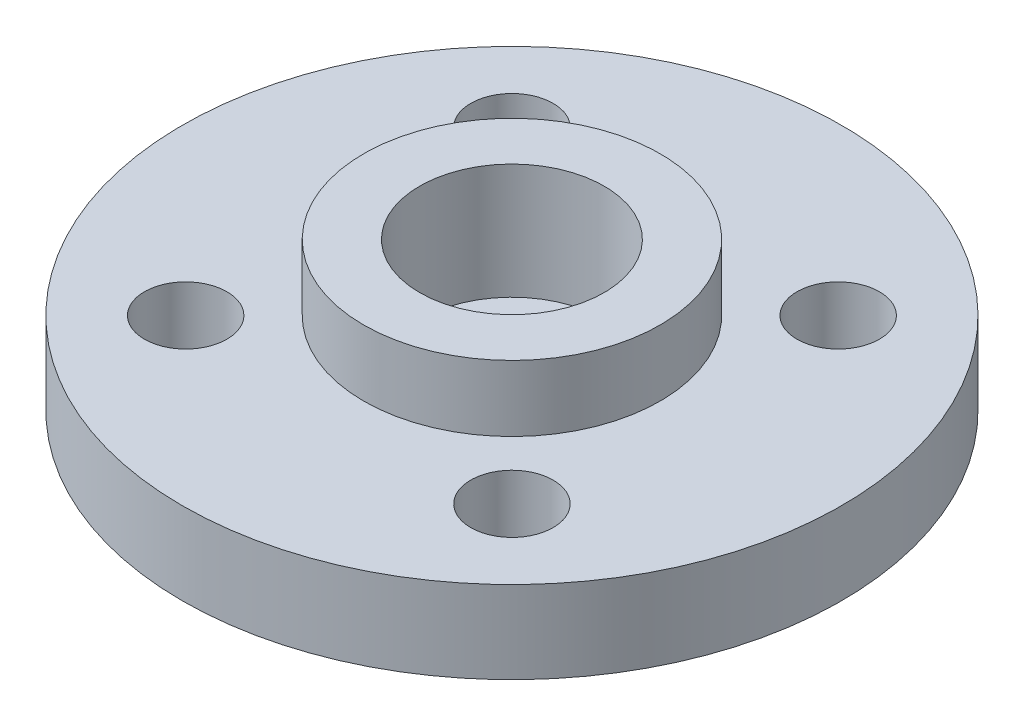
ISO-10303-21;
HEADER;
FILE_DESCRIPTION(('STEP AP214'),'2;1');
FILE_NAME('part.step','',(''),(''),'','','');
FILE_SCHEMA(('AUTOMOTIVE_DESIGN { 1 0 10303 214 1 1 1 1 }'));
ENDSEC;
DATA;
#1=APPLICATION_CONTEXT('core data for automotive mechanical design processes');
#2=APPLICATION_PROTOCOL_DEFINITION('international standard','automotive_design',2000,#1);
#3=PRODUCT_CONTEXT('',#1,'mechanical');
#4=PRODUCT('Part','Part','',(#3));
#5=PRODUCT_RELATED_PRODUCT_CATEGORY('part','',(#4));
#6=PRODUCT_DEFINITION_FORMATION('','',#4);
#7=PRODUCT_DEFINITION_CONTEXT('part definition',#1,'design');
#8=PRODUCT_DEFINITION('design','',#6,#7);
#9=PRODUCT_DEFINITION_SHAPE('','',#8);
#10=(LENGTH_UNIT() NAMED_UNIT(*) SI_UNIT(.MILLI.,.METRE.));
#11=(NAMED_UNIT(*) PLANE_ANGLE_UNIT() SI_UNIT($,.RADIAN.));
#12=(NAMED_UNIT(*) SI_UNIT($,.STERADIAN.) SOLID_ANGLE_UNIT());
#13=UNCERTAINTY_MEASURE_WITH_UNIT(LENGTH_MEASURE(1.E-05),#10,'distance_accuracy_value','');
#14=(GEOMETRIC_REPRESENTATION_CONTEXT(3) GLOBAL_UNCERTAINTY_ASSIGNED_CONTEXT((#13)) GLOBAL_UNIT_ASSIGNED_CONTEXT((#10,
#11,#12)) REPRESENTATION_CONTEXT('',''));
#15=CARTESIAN_POINT('',(0.,0.,0.));
#16=DIRECTION('',(0.,0.,1.));
#17=DIRECTION('',(1.,0.,0.));
#18=AXIS2_PLACEMENT_3D('',#15,#16,#17);
#19=CARTESIAN_POINT('',(0.,2.5,0.));
#20=DIRECTION('',(0.,-1.,0.));
#21=DIRECTION('',(0.,0.,-1.));
#22=AXIS2_PLACEMENT_3D('',#19,#20,#21);
#23=CYLINDRICAL_SURFACE('',#22,1.6);
#24=CARTESIAN_POINT('',(0.,0.,0.));
#25=DIRECTION('',(0.,1.,0.));
#26=DIRECTION('',(0.,0.,1.));
#27=AXIS2_PLACEMENT_3D('',#24,#25,#26);
#28=CIRCLE('',#27,1.6);
#29=CARTESIAN_POINT('',(0.,0.,1.6));
#30=VERTEX_POINT('',#29);
#31=EDGE_CURVE('E41',#30,#30,#28,.T.);
#32=ORIENTED_EDGE('',*,*,#31,.F.);
#33=EDGE_LOOP('',(#32));
#34=FACE_BOUND('',#33,.T.);
#35=CARTESIAN_POINT('',(0.,1.,0.));
#36=DIRECTION('',(0.,1.,0.));
#37=DIRECTION('',(0.,0.,1.));
#38=AXIS2_PLACEMENT_3D('',#35,#36,#37);
#39=CIRCLE('',#38,1.6);
#40=CARTESIAN_POINT('',(0.,1.,1.6));
#41=VERTEX_POINT('',#40);
#42=EDGE_CURVE('E81',#41,#41,#39,.T.);
#43=ORIENTED_EDGE('',*,*,#42,.T.);
#44=EDGE_LOOP('',(#43));
#45=FACE_BOUND('',#44,.T.);
#46=ADVANCED_FACE('F30',(#34,#45),#23,.F.);
#47=CARTESIAN_POINT('',(0.,2.5,0.));
#48=DIRECTION('',(0.,1.,0.));
#49=DIRECTION('',(0.,0.,1.));
#50=AXIS2_PLACEMENT_3D('',#47,#48,#49);
#51=PLANE('',#50);
#52=CARTESIAN_POINT('',(4.94974746830583,2.5,4.94974746830583));
#53=DIRECTION('',(0.,1.,0.));
#54=DIRECTION('',(0.,0.,1.));
#55=AXIS2_PLACEMENT_3D('',#52,#53,#54);
#56=CIRCLE('',#55,1.24999999999999);
#57=CARTESIAN_POINT('',(4.94974746830583,2.5,6.19974746830582));
#58=VERTEX_POINT('',#57);
#59=EDGE_CURVE('E75',#58,#58,#56,.T.);
#60=ORIENTED_EDGE('',*,*,#59,.F.);
#61=EDGE_LOOP('',(#60));
#62=FACE_BOUND('',#61,.T.);
#63=CARTESIAN_POINT('',(-4.94974746830583,2.5,4.94974746830583));
#64=DIRECTION('',(0.,1.,0.));
#65=DIRECTION('',(0.,0.,1.));
#66=AXIS2_PLACEMENT_3D('',#63,#64,#65);
#67=CIRCLE('',#66,1.24999999999999);
#68=CARTESIAN_POINT('',(-4.94974746830583,2.5,6.19974746830582));
#69=VERTEX_POINT('',#68);
#70=EDGE_CURVE('E69',#69,#69,#67,.T.);
#71=ORIENTED_EDGE('',*,*,#70,.F.);
#72=EDGE_LOOP('',(#71));
#73=FACE_BOUND('',#72,.T.);
#74=CARTESIAN_POINT('',(-4.94974746830583,2.5,-4.94974746830583));
#75=DIRECTION('',(0.,1.,0.));
#76=DIRECTION('',(0.,0.,1.));
#77=AXIS2_PLACEMENT_3D('',#74,#75,#76);
#78=CIRCLE('',#77,1.24999999999999);
#79=CARTESIAN_POINT('',(-4.94974746830583,2.5,-3.69974746830585));
#80=VERTEX_POINT('',#79);
#81=EDGE_CURVE('E63',#80,#80,#78,.T.);
#82=ORIENTED_EDGE('',*,*,#81,.F.);
#83=EDGE_LOOP('',(#82));
#84=FACE_BOUND('',#83,.T.);
#85=CARTESIAN_POINT('',(4.94974746830583,2.5,-4.94974746830583));
#86=DIRECTION('',(0.,1.,0.));
#87=DIRECTION('',(0.,0.,1.));
#88=AXIS2_PLACEMENT_3D('',#85,#86,#87);
#89=CIRCLE('',#88,1.24999999999999);
#90=CARTESIAN_POINT('',(4.94974746830583,2.5,-3.69974746830585));
#91=VERTEX_POINT('',#90);
#92=EDGE_CURVE('E57',#91,#91,#89,.T.);
#93=ORIENTED_EDGE('',*,*,#92,.F.);
#94=EDGE_LOOP('',(#93));
#95=FACE_BOUND('',#94,.T.);
#96=CARTESIAN_POINT('',(0.,2.5,0.));
#97=DIRECTION('',(0.,1.,0.));
#98=DIRECTION('',(0.,0.,1.));
#99=AXIS2_PLACEMENT_3D('',#96,#97,#98);
#100=CIRCLE('',#99,4.5);
#101=CARTESIAN_POINT('',(0.,2.5,4.5));
#102=VERTEX_POINT('',#101);
#103=EDGE_CURVE('E46',#102,#102,#100,.T.);
#104=ORIENTED_EDGE('',*,*,#103,.F.);
#105=EDGE_LOOP('',(#104));
#106=FACE_BOUND('',#105,.T.);
#107=CARTESIAN_POINT('',(0.,2.5,0.));
#108=DIRECTION('',(0.,1.,0.));
#109=DIRECTION('',(0.,0.,1.));
#110=AXIS2_PLACEMENT_3D('',#107,#108,#109);
#111=CIRCLE('',#110,10.);
#112=CARTESIAN_POINT('',(0.,2.5,10.));
#113=VERTEX_POINT('',#112);
#114=EDGE_CURVE('E10',#113,#113,#111,.T.);
#115=ORIENTED_EDGE('',*,*,#114,.T.);
#116=EDGE_LOOP('',(#115));
#117=FACE_BOUND('',#116,.T.);
#118=ADVANCED_FACE('F111',(#62,#73,#84,#95,#106,#117),#51,.T.);
#119=CARTESIAN_POINT('',(0.,0.,0.));
#120=DIRECTION('',(0.,1.,0.));
#121=DIRECTION('',(0.,0.,1.));
#122=AXIS2_PLACEMENT_3D('',#119,#120,#121);
#123=PLANE('',#122);
#124=CARTESIAN_POINT('',(4.94974746830583,0.,4.94974746830583));
#125=DIRECTION('',(0.,1.,0.));
#126=DIRECTION('',(0.,0.,1.));
#127=AXIS2_PLACEMENT_3D('',#124,#125,#126);
#128=CIRCLE('',#127,1.25);
#129=CARTESIAN_POINT('',(4.94974746830583,0.,6.19974746830583));
#130=VERTEX_POINT('',#129);
#131=EDGE_CURVE('E72',#130,#130,#128,.T.);
#132=ORIENTED_EDGE('',*,*,#131,.T.);
#133=EDGE_LOOP('',(#132));
#134=FACE_BOUND('',#133,.T.);
#135=CARTESIAN_POINT('',(-4.94974746830583,0.,4.94974746830583));
#136=DIRECTION('',(0.,1.,0.));
#137=DIRECTION('',(0.,0.,1.));
#138=AXIS2_PLACEMENT_3D('',#135,#136,#137);
#139=CIRCLE('',#138,1.25);
#140=CARTESIAN_POINT('',(-4.94974746830583,0.,6.19974746830583));
#141=VERTEX_POINT('',#140);
#142=EDGE_CURVE('E66',#141,#141,#139,.T.);
#143=ORIENTED_EDGE('',*,*,#142,.T.);
#144=EDGE_LOOP('',(#143));
#145=FACE_BOUND('',#144,.T.);
#146=CARTESIAN_POINT('',(-4.94974746830583,0.,-4.94974746830583));
#147=DIRECTION('',(0.,1.,0.));
#148=DIRECTION('',(0.,0.,1.));
#149=AXIS2_PLACEMENT_3D('',#146,#147,#148);
#150=CIRCLE('',#149,1.25);
#151=CARTESIAN_POINT('',(-4.94974746830583,0.,-3.69974746830583));
#152=VERTEX_POINT('',#151);
#153=EDGE_CURVE('E60',#152,#152,#150,.T.);
#154=ORIENTED_EDGE('',*,*,#153,.T.);
#155=EDGE_LOOP('',(#154));
#156=FACE_BOUND('',#155,.T.);
#157=CARTESIAN_POINT('',(4.94974746830583,0.,-4.94974746830583));
#158=DIRECTION('',(0.,1.,0.));
#159=DIRECTION('',(0.,0.,1.));
#160=AXIS2_PLACEMENT_3D('',#157,#158,#159);
#161=CIRCLE('',#160,1.25);
#162=CARTESIAN_POINT('',(4.94974746830583,0.,-3.69974746830583));
#163=VERTEX_POINT('',#162);
#164=EDGE_CURVE('E54',#163,#163,#161,.T.);
#165=ORIENTED_EDGE('',*,*,#164,.T.);
#166=EDGE_LOOP('',(#165));
#167=FACE_BOUND('',#166,.T.);
#168=CARTESIAN_POINT('',(0.,0.,0.));
#169=DIRECTION('',(0.,1.,0.));
#170=DIRECTION('',(0.,0.,1.));
#171=AXIS2_PLACEMENT_3D('',#168,#169,#170);
#172=CIRCLE('',#171,10.);
#173=CARTESIAN_POINT('',(0.,0.,10.));
#174=VERTEX_POINT('',#173);
#175=EDGE_CURVE('E34',#174,#174,#172,.T.);
#176=ORIENTED_EDGE('',*,*,#175,.F.);
#177=EDGE_LOOP('',(#176));
#178=FACE_BOUND('',#177,.T.);
#179=ORIENTED_EDGE('',*,*,#31,.T.);
#180=EDGE_LOOP('',(#179));
#181=FACE_BOUND('',#180,.T.);
#182=ADVANCED_FACE('F117',(#134,#145,#156,#167,#178,#181),#123,.F.);
#183=CARTESIAN_POINT('',(0.,2.5,0.));
#184=DIRECTION('',(0.,-1.,0.));
#185=DIRECTION('',(0.,0.,-1.));
#186=AXIS2_PLACEMENT_3D('',#183,#184,#185);
#187=CYLINDRICAL_SURFACE('',#186,10.);
#188=ORIENTED_EDGE('',*,*,#114,.F.);
#189=EDGE_LOOP('',(#188));
#190=FACE_BOUND('',#189,.T.);
#191=ORIENTED_EDGE('',*,*,#175,.T.);
#192=EDGE_LOOP('',(#191));
#193=FACE_BOUND('',#192,.T.);
#194=ADVANCED_FACE('F32',(#190,#193),#187,.T.);
#195=CARTESIAN_POINT('',(0.,4.5,0.));
#196=DIRECTION('',(0.,1.,0.));
#197=DIRECTION('',(0.,0.,1.));
#198=AXIS2_PLACEMENT_3D('',#195,#196,#197);
#199=PLANE('',#198);
#200=CARTESIAN_POINT('',(0.,4.5,0.));
#201=DIRECTION('',(0.,1.,0.));
#202=DIRECTION('',(0.,0.,1.));
#203=AXIS2_PLACEMENT_3D('',#200,#201,#202);
#204=CIRCLE('',#203,4.5);
#205=CARTESIAN_POINT('',(0.,4.5,4.5));
#206=VERTEX_POINT('',#205);
#207=EDGE_CURVE('E45',#206,#206,#204,.T.);
#208=ORIENTED_EDGE('',*,*,#207,.T.);
#209=EDGE_LOOP('',(#208));
#210=FACE_BOUND('',#209,.T.);
#211=CARTESIAN_POINT('',(0.,4.5,0.));
#212=DIRECTION('',(0.,1.,0.));
#213=DIRECTION('',(0.,0.,1.));
#214=AXIS2_PLACEMENT_3D('',#211,#212,#213);
#215=CIRCLE('',#214,2.8);
#216=CARTESIAN_POINT('',(0.,4.5,2.8));
#217=VERTEX_POINT('',#216);
#218=EDGE_CURVE('E49',#217,#217,#215,.T.);
#219=ORIENTED_EDGE('',*,*,#218,.F.);
#220=EDGE_LOOP('',(#219));
#221=FACE_BOUND('',#220,.T.);
#222=ADVANCED_FACE('F106',(#210,#221),#199,.T.);
#223=CARTESIAN_POINT('',(0.,4.5,0.));
#224=DIRECTION('',(0.,-1.,0.));
#225=DIRECTION('',(0.,0.,-1.));
#226=AXIS2_PLACEMENT_3D('',#223,#224,#225);
#227=CYLINDRICAL_SURFACE('',#226,4.5);
#228=ORIENTED_EDGE('',*,*,#207,.F.);
#229=EDGE_LOOP('',(#228));
#230=FACE_BOUND('',#229,.T.);
#231=ORIENTED_EDGE('',*,*,#103,.T.);
#232=EDGE_LOOP('',(#231));
#233=FACE_BOUND('',#232,.T.);
#234=ADVANCED_FACE('F96',(#230,#233),#227,.T.);
#235=CARTESIAN_POINT('',(0.,4.5,0.));
#236=DIRECTION('',(0.,-1.,0.));
#237=DIRECTION('',(0.,0.,-1.));
#238=AXIS2_PLACEMENT_3D('',#235,#236,#237);
#239=CYLINDRICAL_SURFACE('',#238,2.8);
#240=ORIENTED_EDGE('',*,*,#218,.T.);
#241=EDGE_LOOP('',(#240));
#242=FACE_BOUND('',#241,.T.);
#243=CARTESIAN_POINT('',(0.,1.,0.));
#244=DIRECTION('',(0.,1.,0.));
#245=DIRECTION('',(0.,0.,1.));
#246=AXIS2_PLACEMENT_3D('',#243,#244,#245);
#247=CIRCLE('',#246,2.8);
#248=CARTESIAN_POINT('',(0.,1.,2.8));
#249=VERTEX_POINT('',#248);
#250=EDGE_CURVE('E78',#249,#249,#247,.T.);
#251=ORIENTED_EDGE('',*,*,#250,.F.);
#252=EDGE_LOOP('',(#251));
#253=FACE_BOUND('',#252,.T.);
#254=ADVANCED_FACE('F93',(#242,#253),#239,.F.);
#255=CARTESIAN_POINT('',(4.94974746830583,2.5,-4.94974746830583));
#256=DIRECTION('',(0.,1.,0.));
#257=DIRECTION('',(0.,0.,1.));
#258=AXIS2_PLACEMENT_3D('',#255,#256,#257);
#259=CYLINDRICAL_SURFACE('',#258,1.24999999999999);
#260=ORIENTED_EDGE('',*,*,#164,.F.);
#261=EDGE_LOOP('',(#260));
#262=FACE_BOUND('',#261,.T.);
#263=ORIENTED_EDGE('',*,*,#92,.T.);
#264=EDGE_LOOP('',(#263));
#265=FACE_BOUND('',#264,.T.);
#266=ADVANCED_FACE('F95',(#262,#265),#259,.F.);
#267=CARTESIAN_POINT('',(-4.94974746830583,2.5,-4.94974746830583));
#268=DIRECTION('',(0.,1.,0.));
#269=DIRECTION('',(0.,0.,1.));
#270=AXIS2_PLACEMENT_3D('',#267,#268,#269);
#271=CYLINDRICAL_SURFACE('',#270,1.24999999999999);
#272=ORIENTED_EDGE('',*,*,#153,.F.);
#273=EDGE_LOOP('',(#272));
#274=FACE_BOUND('',#273,.T.);
#275=ORIENTED_EDGE('',*,*,#81,.T.);
#276=EDGE_LOOP('',(#275));
#277=FACE_BOUND('',#276,.T.);
#278=ADVANCED_FACE('F103',(#274,#277),#271,.F.);
#279=CARTESIAN_POINT('',(-4.94974746830583,2.5,4.94974746830583));
#280=DIRECTION('',(0.,1.,0.));
#281=DIRECTION('',(0.,0.,1.));
#282=AXIS2_PLACEMENT_3D('',#279,#280,#281);
#283=CYLINDRICAL_SURFACE('',#282,1.24999999999999);
#284=ORIENTED_EDGE('',*,*,#142,.F.);
#285=EDGE_LOOP('',(#284));
#286=FACE_BOUND('',#285,.T.);
#287=ORIENTED_EDGE('',*,*,#70,.T.);
#288=EDGE_LOOP('',(#287));
#289=FACE_BOUND('',#288,.T.);
#290=ADVANCED_FACE('F147',(#286,#289),#283,.F.);
#291=CARTESIAN_POINT('',(4.94974746830583,2.5,4.94974746830583));
#292=DIRECTION('',(0.,1.,0.));
#293=DIRECTION('',(0.,0.,1.));
#294=AXIS2_PLACEMENT_3D('',#291,#292,#293);
#295=CYLINDRICAL_SURFACE('',#294,1.24999999999999);
#296=ORIENTED_EDGE('',*,*,#131,.F.);
#297=EDGE_LOOP('',(#296));
#298=FACE_BOUND('',#297,.T.);
#299=ORIENTED_EDGE('',*,*,#59,.T.);
#300=EDGE_LOOP('',(#299));
#301=FACE_BOUND('',#300,.T.);
#302=ADVANCED_FACE('F89',(#298,#301),#295,.F.);
#303=CARTESIAN_POINT('',(0.,1.,0.));
#304=DIRECTION('',(0.,1.,0.));
#305=DIRECTION('',(0.,0.,1.));
#306=AXIS2_PLACEMENT_3D('',#303,#304,#305);
#307=PLANE('',#306);
#308=ORIENTED_EDGE('',*,*,#42,.F.);
#309=EDGE_LOOP('',(#308));
#310=FACE_BOUND('',#309,.T.);
#311=ORIENTED_EDGE('',*,*,#250,.T.);
#312=EDGE_LOOP('',(#311));
#313=FACE_BOUND('',#312,.T.);
#314=ADVANCED_FACE('F86',(#310,#313),#307,.T.);
#315=CLOSED_SHELL('',(#46,#118,#182,#194,#222,#234,#254,#266,#278,#290,#302,#314));
#316=MANIFOLD_SOLID_BREP('B2',#315);
#317=ADVANCED_BREP_SHAPE_REPRESENTATION('',(#18,#316),#14);
#318=SHAPE_DEFINITION_REPRESENTATION(#9,#317);
ENDSEC;
END-ISO-10303-21;
